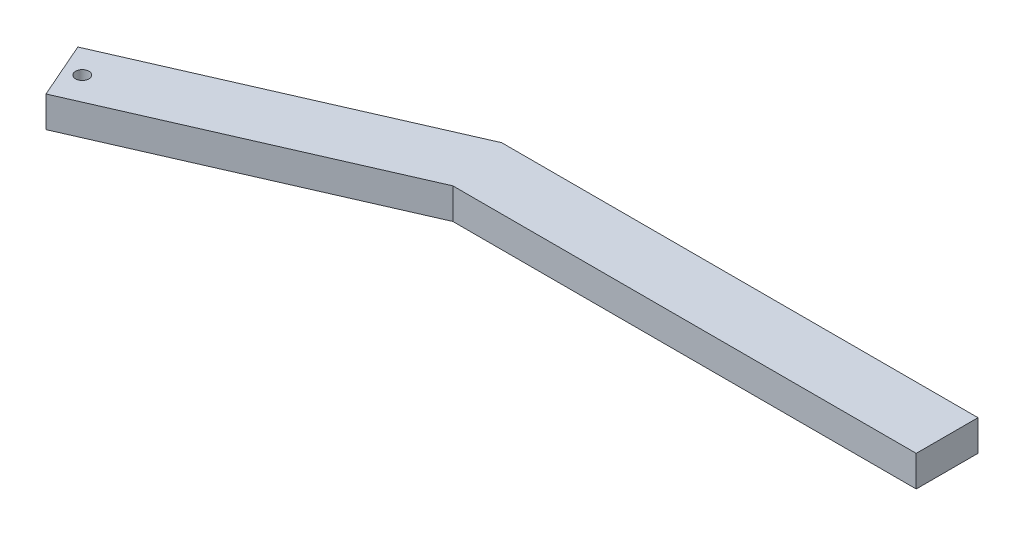
ISO-10303-21;
HEADER;
FILE_DESCRIPTION(('STEP AP214'),'2;1');
FILE_NAME('part.step','',(''),(''),'','','');
FILE_SCHEMA(('AUTOMOTIVE_DESIGN { 1 0 10303 214 1 1 1 1 }'));
ENDSEC;
DATA;
#1=APPLICATION_CONTEXT('core data for automotive mechanical design processes');
#2=APPLICATION_PROTOCOL_DEFINITION('international standard','automotive_design',2000,#1);
#3=PRODUCT_CONTEXT('',#1,'mechanical');
#4=PRODUCT('Part','Part','',(#3));
#5=PRODUCT_RELATED_PRODUCT_CATEGORY('part','',(#4));
#6=PRODUCT_DEFINITION_FORMATION('','',#4);
#7=PRODUCT_DEFINITION_CONTEXT('part definition',#1,'design');
#8=PRODUCT_DEFINITION('design','',#6,#7);
#9=PRODUCT_DEFINITION_SHAPE('','',#8);
#10=(LENGTH_UNIT() NAMED_UNIT(*) SI_UNIT(.MILLI.,.METRE.));
#11=(NAMED_UNIT(*) PLANE_ANGLE_UNIT() SI_UNIT($,.RADIAN.));
#12=(NAMED_UNIT(*) SI_UNIT($,.STERADIAN.) SOLID_ANGLE_UNIT());
#13=UNCERTAINTY_MEASURE_WITH_UNIT(LENGTH_MEASURE(1.E-05),#10,'distance_accuracy_value','');
#14=(GEOMETRIC_REPRESENTATION_CONTEXT(3) GLOBAL_UNCERTAINTY_ASSIGNED_CONTEXT((#13)) GLOBAL_UNIT_ASSIGNED_CONTEXT((#10,
#11,#12)) REPRESENTATION_CONTEXT('',''));
#15=CARTESIAN_POINT('',(0.,0.,0.));
#16=DIRECTION('',(0.,0.,1.));
#17=DIRECTION('',(1.,0.,0.));
#18=AXIS2_PLACEMENT_3D('',#15,#16,#17);
#19=CARTESIAN_POINT('',(20.3717259608542,25.4,46.5363597778754));
#20=DIRECTION('',(0.916070074367626,0.,-0.40101822757587));
#21=DIRECTION('',(-0.40101822757587,0.,-0.916070074367626));
#22=AXIS2_PLACEMENT_3D('',#19,#20,#21);
#23=PLANE('',#22);
#24=DIRECTION('',(0.40101822757587,0.,0.916070074367626));
#25=VECTOR('',#24,1.);
#26=CARTESIAN_POINT('',(20.3717259608542,0.,46.5363597778754));
#27=LINE('',#26,#25);
#28=CARTESIAN_POINT('',(0.,0.,0.));
#29=VERTEX_POINT('',#28);
#30=CARTESIAN_POINT('',(20.3717259608542,0.,46.5363597778754));
#31=VERTEX_POINT('',#30);
#32=EDGE_CURVE('E119',#29,#31,#27,.T.);
#33=ORIENTED_EDGE('',*,*,#32,.T.);
#34=DIRECTION('',(0.,-1.,0.));
#35=VECTOR('',#34,1.);
#36=CARTESIAN_POINT('',(20.3717259608542,25.4,46.5363597778754));
#37=LINE('',#36,#35);
#38=CARTESIAN_POINT('',(20.3717259608542,25.4,46.5363597778754));
#39=VERTEX_POINT('',#38);
#40=EDGE_CURVE('E11',#39,#31,#37,.T.);
#41=ORIENTED_EDGE('',*,*,#40,.F.);
#42=DIRECTION('',(0.40101822757587,0.,0.916070074367626));
#43=VECTOR('',#42,1.);
#44=CARTESIAN_POINT('',(20.3717259608542,25.4,46.5363597778754));
#45=LINE('',#44,#43);
#46=CARTESIAN_POINT('',(0.,25.4,0.));
#47=VERTEX_POINT('',#46);
#48=EDGE_CURVE('E130',#47,#39,#45,.T.);
#49=ORIENTED_EDGE('',*,*,#48,.F.);
#50=DIRECTION('',(0.,-1.,0.));
#51=VECTOR('',#50,1.);
#52=CARTESIAN_POINT('',(0.,25.4,0.));
#53=LINE('',#52,#51);
#54=EDGE_CURVE('E115',#47,#29,#53,.T.);
#55=ORIENTED_EDGE('',*,*,#54,.T.);
#56=EDGE_LOOP('',(#33,#41,#49,#55));
#57=FACE_BOUND('',#56,.T.);
#58=ADVANCED_FACE('F35',(#57),#23,.F.);
#59=CARTESIAN_POINT('',(253.053524850231,25.4,-55.3222700263955));
#60=DIRECTION('',(-0.40101822757587,0.,-0.916070074367626));
#61=DIRECTION('',(-0.916070074367626,0.,0.40101822757587));
#62=AXIS2_PLACEMENT_3D('',#59,#60,#61);
#63=PLANE('',#62);
#64=DIRECTION('',(0.916070074367626,0.,-0.40101822757587));
#65=VECTOR('',#64,1.);
#66=CARTESIAN_POINT('',(253.053524850231,0.,-55.3222700263955));
#67=LINE('',#66,#65);
#68=CARTESIAN_POINT('',(253.053524850231,0.,-55.3222700263955));
#69=VERTEX_POINT('',#68);
#70=EDGE_CURVE('E122',#31,#69,#67,.T.);
#71=ORIENTED_EDGE('',*,*,#70,.T.);
#72=DIRECTION('',(0.,-1.,0.));
#73=VECTOR('',#72,1.);
#74=CARTESIAN_POINT('',(253.053524850231,25.4,-55.3222700263955));
#75=LINE('',#74,#73);
#76=CARTESIAN_POINT('',(253.053524850231,25.4,-55.3222700263955));
#77=VERTEX_POINT('',#76);
#78=EDGE_CURVE('E43',#77,#69,#75,.T.);
#79=ORIENTED_EDGE('',*,*,#78,.F.);
#80=DIRECTION('',(0.916070074367626,0.,-0.40101822757587));
#81=VECTOR('',#80,1.);
#82=CARTESIAN_POINT('',(253.053524850231,25.4,-55.3222700263955));
#83=LINE('',#82,#81);
#84=EDGE_CURVE('E88',#39,#77,#83,.T.);
#85=ORIENTED_EDGE('',*,*,#84,.F.);
#86=ORIENTED_EDGE('',*,*,#40,.T.);
#87=EDGE_LOOP('',(#71,#79,#85,#86));
#88=FACE_BOUND('',#87,.T.);
#89=ADVANCED_FACE('F155',(#88),#63,.F.);
#90=CARTESIAN_POINT('',(634.053524850231,25.4,-55.3222700263955));
#91=DIRECTION('',(0.,0.,-1.));
#92=DIRECTION('',(-1.,0.,0.));
#93=AXIS2_PLACEMENT_3D('',#90,#91,#92);
#94=PLANE('',#93);
#95=DIRECTION('',(1.,0.,0.));
#96=VECTOR('',#95,1.);
#97=CARTESIAN_POINT('',(634.053524850231,0.,-55.3222700263955));
#98=LINE('',#97,#96);
#99=CARTESIAN_POINT('',(634.053524850231,0.,-55.3222700263955));
#100=VERTEX_POINT('',#99);
#101=EDGE_CURVE('E125',#69,#100,#98,.T.);
#102=ORIENTED_EDGE('',*,*,#101,.T.);
#103=DIRECTION('',(0.,-1.,0.));
#104=VECTOR('',#103,1.);
#105=CARTESIAN_POINT('',(634.053524850231,25.4,-55.3222700263955));
#106=LINE('',#105,#104);
#107=CARTESIAN_POINT('',(634.053524850231,25.4,-55.3222700263955));
#108=VERTEX_POINT('',#107);
#109=EDGE_CURVE('E110',#108,#100,#106,.T.);
#110=ORIENTED_EDGE('',*,*,#109,.F.);
#111=DIRECTION('',(1.,0.,0.));
#112=VECTOR('',#111,1.);
#113=CARTESIAN_POINT('',(634.053524850231,25.4,-55.3222700263955));
#114=LINE('',#113,#112);
#115=EDGE_CURVE('E101',#77,#108,#114,.T.);
#116=ORIENTED_EDGE('',*,*,#115,.F.);
#117=ORIENTED_EDGE('',*,*,#78,.T.);
#118=EDGE_LOOP('',(#102,#110,#116,#117));
#119=FACE_BOUND('',#118,.T.);
#120=ADVANCED_FACE('F136',(#119),#94,.F.);
#121=CARTESIAN_POINT('',(634.053524850231,25.4,-106.122270026396));
#122=DIRECTION('',(-1.,0.,0.));
#123=DIRECTION('',(0.,0.,1.));
#124=AXIS2_PLACEMENT_3D('',#121,#122,#123);
#125=PLANE('',#124);
#126=DIRECTION('',(0.,0.,-1.));
#127=VECTOR('',#126,1.);
#128=CARTESIAN_POINT('',(634.053524850231,0.,-106.122270026396));
#129=LINE('',#128,#127);
#130=CARTESIAN_POINT('',(634.053524850231,0.,-106.122270026396));
#131=VERTEX_POINT('',#130);
#132=EDGE_CURVE('E109',#100,#131,#129,.T.);
#133=ORIENTED_EDGE('',*,*,#132,.T.);
#134=DIRECTION('',(0.,-1.,0.));
#135=VECTOR('',#134,1.);
#136=CARTESIAN_POINT('',(634.053524850231,25.4,-106.122270026396));
#137=LINE('',#136,#135);
#138=CARTESIAN_POINT('',(634.053524850231,25.4,-106.122270026396));
#139=VERTEX_POINT('',#138);
#140=EDGE_CURVE('E106',#139,#131,#137,.T.);
#141=ORIENTED_EDGE('',*,*,#140,.F.);
#142=DIRECTION('',(0.,0.,-1.));
#143=VECTOR('',#142,1.);
#144=CARTESIAN_POINT('',(634.053524850231,25.4,-106.122270026396));
#145=LINE('',#144,#143);
#146=EDGE_CURVE('E95',#108,#139,#145,.T.);
#147=ORIENTED_EDGE('',*,*,#146,.F.);
#148=ORIENTED_EDGE('',*,*,#109,.T.);
#149=EDGE_LOOP('',(#133,#141,#147,#148));
#150=FACE_BOUND('',#149,.T.);
#151=ADVANCED_FACE('F107',(#150),#125,.F.);
#152=CARTESIAN_POINT('',(242.421488875463,25.4,-106.122270026396));
#153=DIRECTION('',(0.,0.,1.));
#154=DIRECTION('',(1.,0.,0.));
#155=AXIS2_PLACEMENT_3D('',#152,#153,#154);
#156=PLANE('',#155);
#157=DIRECTION('',(-1.,0.,0.));
#158=VECTOR('',#157,1.);
#159=CARTESIAN_POINT('',(242.421488875463,0.,-106.122270026396));
#160=LINE('',#159,#158);
#161=CARTESIAN_POINT('',(242.421488875463,0.,-106.122270026396));
#162=VERTEX_POINT('',#161);
#163=EDGE_CURVE('E74',#131,#162,#160,.T.);
#164=ORIENTED_EDGE('',*,*,#163,.T.);
#165=DIRECTION('',(0.,-1.,0.));
#166=VECTOR('',#165,1.);
#167=CARTESIAN_POINT('',(242.421488875463,25.4,-106.122270026396));
#168=LINE('',#167,#166);
#169=CARTESIAN_POINT('',(242.421488875463,25.4,-106.122270026396));
#170=VERTEX_POINT('',#169);
#171=EDGE_CURVE('E111',#170,#162,#168,.T.);
#172=ORIENTED_EDGE('',*,*,#171,.F.);
#173=DIRECTION('',(-1.,0.,0.));
#174=VECTOR('',#173,1.);
#175=CARTESIAN_POINT('',(242.421488875463,25.4,-106.122270026396));
#176=LINE('',#175,#174);
#177=EDGE_CURVE('E99',#139,#170,#176,.T.);
#178=ORIENTED_EDGE('',*,*,#177,.F.);
#179=ORIENTED_EDGE('',*,*,#140,.T.);
#180=EDGE_LOOP('',(#164,#172,#178,#179));
#181=FACE_BOUND('',#180,.T.);
#182=ADVANCED_FACE('F113',(#181),#156,.F.);
#183=CARTESIAN_POINT('',(0.,25.4,0.));
#184=DIRECTION('',(0.40101822757587,0.,0.916070074367626));
#185=DIRECTION('',(0.916070074367626,0.,-0.40101822757587));
#186=AXIS2_PLACEMENT_3D('',#183,#184,#185);
#187=PLANE('',#186);
#188=DIRECTION('',(-0.916070074367626,0.,0.40101822757587));
#189=VECTOR('',#188,1.);
#190=CARTESIAN_POINT('',(0.,0.,0.));
#191=LINE('',#190,#189);
#192=EDGE_CURVE('E80',#162,#29,#191,.T.);
#193=ORIENTED_EDGE('',*,*,#192,.T.);
#194=ORIENTED_EDGE('',*,*,#54,.F.);
#195=DIRECTION('',(-0.916070074367626,0.,0.40101822757587));
#196=VECTOR('',#195,1.);
#197=CARTESIAN_POINT('',(0.,25.4,0.));
#198=LINE('',#197,#196);
#199=EDGE_CURVE('E51',#170,#47,#198,.T.);
#200=ORIENTED_EDGE('',*,*,#199,.F.);
#201=ORIENTED_EDGE('',*,*,#171,.T.);
#202=EDGE_LOOP('',(#193,#194,#200,#201));
#203=FACE_BOUND('',#202,.T.);
#204=ADVANCED_FACE('F143',(#203),#187,.F.);
#205=CARTESIAN_POINT('',(0.,25.4,0.));
#206=DIRECTION('',(0.,-1.,0.));
#207=DIRECTION('',(0.,0.,-1.));
#208=AXIS2_PLACEMENT_3D('',#205,#206,#207);
#209=PLANE('',#208);
#210=CARTESIAN_POINT('',(21.8199529248959,25.4,18.1752483987242));
#211=DIRECTION('',(0.,-1.,0.));
#212=DIRECTION('',(0.,0.,-1.));
#213=AXIS2_PLACEMENT_3D('',#210,#211,#212);
#214=CIRCLE('',#213,5.49999999999999);
#215=CARTESIAN_POINT('',(21.8199529248959,25.4,12.6752483987242));
#216=VERTEX_POINT('',#215);
#217=EDGE_CURVE('E123',#216,#216,#214,.T.);
#218=ORIENTED_EDGE('',*,*,#217,.T.);
#219=EDGE_LOOP('',(#218));
#220=FACE_BOUND('',#219,.T.);
#221=ORIENTED_EDGE('',*,*,#48,.T.);
#222=ORIENTED_EDGE('',*,*,#84,.T.);
#223=ORIENTED_EDGE('',*,*,#115,.T.);
#224=ORIENTED_EDGE('',*,*,#146,.T.);
#225=ORIENTED_EDGE('',*,*,#177,.T.);
#226=ORIENTED_EDGE('',*,*,#199,.T.);
#227=EDGE_LOOP('',(#221,#222,#223,#224,#225,#226));
#228=FACE_BOUND('',#227,.T.);
#229=ADVANCED_FACE('F97',(#220,#228),#209,.F.);
#230=CARTESIAN_POINT('',(0.,0.,0.));
#231=DIRECTION('',(0.,-1.,0.));
#232=DIRECTION('',(0.,0.,-1.));
#233=AXIS2_PLACEMENT_3D('',#230,#231,#232);
#234=PLANE('',#233);
#235=CARTESIAN_POINT('',(21.8199529248959,0.,18.1752483987242));
#236=DIRECTION('',(0.,-1.,0.));
#237=DIRECTION('',(0.,0.,-1.));
#238=AXIS2_PLACEMENT_3D('',#235,#236,#237);
#239=CIRCLE('',#238,10.);
#240=CARTESIAN_POINT('',(21.8199529248959,0.,8.17524839872415));
#241=VERTEX_POINT('',#240);
#242=EDGE_CURVE('E221',#241,#241,#239,.T.);
#243=ORIENTED_EDGE('',*,*,#242,.F.);
#244=EDGE_LOOP('',(#243));
#245=FACE_BOUND('',#244,.T.);
#246=ORIENTED_EDGE('',*,*,#32,.F.);
#247=ORIENTED_EDGE('',*,*,#192,.F.);
#248=ORIENTED_EDGE('',*,*,#163,.F.);
#249=ORIENTED_EDGE('',*,*,#132,.F.);
#250=ORIENTED_EDGE('',*,*,#101,.F.);
#251=ORIENTED_EDGE('',*,*,#70,.F.);
#252=EDGE_LOOP('',(#246,#247,#248,#249,#250,#251));
#253=FACE_BOUND('',#252,.T.);
#254=ADVANCED_FACE('F139',(#245,#253),#234,.T.);
#255=CARTESIAN_POINT('',(21.8199529248959,0.,18.1752483987242));
#256=DIRECTION('',(0.,-1.,0.));
#257=DIRECTION('',(0.,0.,-1.));
#258=AXIS2_PLACEMENT_3D('',#255,#256,#257);
#259=CYLINDRICAL_SURFACE('',#258,5.5);
#260=ORIENTED_EDGE('',*,*,#217,.F.);
#261=EDGE_LOOP('',(#260));
#262=FACE_BOUND('',#261,.T.);
#263=CARTESIAN_POINT('',(21.8199529248959,4.5,18.1752483987242));
#264=DIRECTION('',(0.,-1.,0.));
#265=DIRECTION('',(0.,0.,-1.));
#266=AXIS2_PLACEMENT_3D('',#263,#264,#265);
#267=CIRCLE('',#266,5.5);
#268=CARTESIAN_POINT('',(21.8199529248959,4.5,12.6752483987242));
#269=VERTEX_POINT('',#268);
#270=EDGE_CURVE('E218',#269,#269,#267,.T.);
#271=ORIENTED_EDGE('',*,*,#270,.T.);
#272=EDGE_LOOP('',(#271));
#273=FACE_BOUND('',#272,.T.);
#274=ADVANCED_FACE('F192',(#262,#273),#259,.F.);
#275=CARTESIAN_POINT('',(21.8199529248959,0.,18.1752483987242));
#276=DIRECTION('',(0.,-1.,0.));
#277=DIRECTION('',(0.,0.,-1.));
#278=AXIS2_PLACEMENT_3D('',#275,#276,#277);
#279=CONICAL_SURFACE('',#278,10.,0.785398163397449);
#280=ORIENTED_EDGE('',*,*,#270,.F.);
#281=EDGE_LOOP('',(#280));
#282=FACE_BOUND('',#281,.T.);
#283=ORIENTED_EDGE('',*,*,#242,.T.);
#284=EDGE_LOOP('',(#283));
#285=FACE_BOUND('',#284,.T.);
#286=ADVANCED_FACE('F201',(#282,#285),#279,.F.);
#287=CLOSED_SHELL('',(#58,#89,#120,#151,#182,#204,#229,#254,#274,#286));
#288=MANIFOLD_SOLID_BREP('B2',#287);
#289=ADVANCED_BREP_SHAPE_REPRESENTATION('',(#18,#288),#14);
#290=SHAPE_DEFINITION_REPRESENTATION(#9,#289);
ENDSEC;
END-ISO-10303-21;
